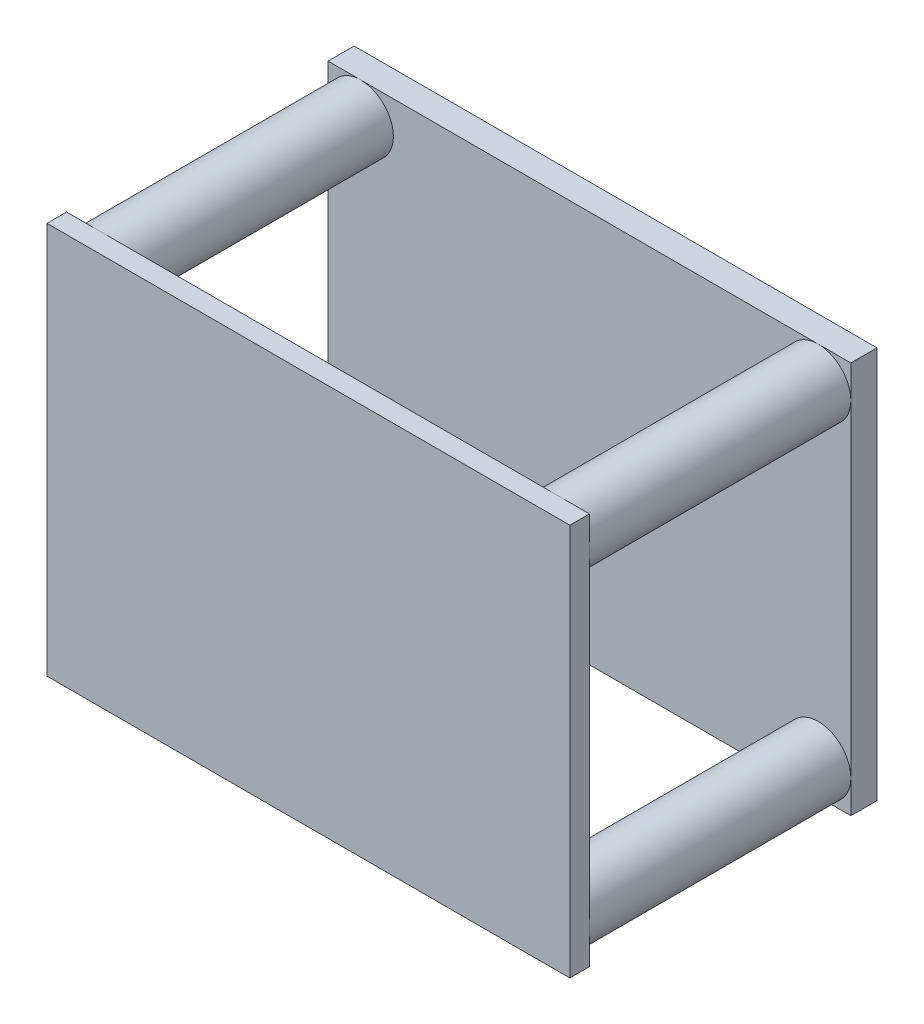
ISO-10303-21;
HEADER;
FILE_DESCRIPTION(('STEP AP214'),'2;1');
FILE_NAME('part.step','',(''),(''),'','','');
FILE_SCHEMA(('AUTOMOTIVE_DESIGN { 1 0 10303 214 1 1 1 1 }'));
ENDSEC;
DATA;
#1=APPLICATION_CONTEXT('core data for automotive mechanical design processes');
#2=APPLICATION_PROTOCOL_DEFINITION('international standard','automotive_design',2000,#1);
#3=PRODUCT_CONTEXT('',#1,'mechanical');
#4=PRODUCT('Part','Part','',(#3));
#5=PRODUCT_RELATED_PRODUCT_CATEGORY('part','',(#4));
#6=PRODUCT_DEFINITION_FORMATION('','',#4);
#7=PRODUCT_DEFINITION_CONTEXT('part definition',#1,'design');
#8=PRODUCT_DEFINITION('design','',#6,#7);
#9=PRODUCT_DEFINITION_SHAPE('','',#8);
#10=(LENGTH_UNIT() NAMED_UNIT(*) SI_UNIT(.MILLI.,.METRE.));
#11=(NAMED_UNIT(*) PLANE_ANGLE_UNIT() SI_UNIT($,.RADIAN.));
#12=(NAMED_UNIT(*) SI_UNIT($,.STERADIAN.) SOLID_ANGLE_UNIT());
#13=UNCERTAINTY_MEASURE_WITH_UNIT(LENGTH_MEASURE(1.E-05),#10,'distance_accuracy_value','');
#14=(GEOMETRIC_REPRESENTATION_CONTEXT(3) GLOBAL_UNCERTAINTY_ASSIGNED_CONTEXT((#13)) GLOBAL_UNIT_ASSIGNED_CONTEXT((#10,
#11,#12)) REPRESENTATION_CONTEXT('',''));
#15=CARTESIAN_POINT('',(0.,0.,0.));
#16=DIRECTION('',(0.,0.,1.));
#17=DIRECTION('',(1.,0.,0.));
#18=AXIS2_PLACEMENT_3D('',#15,#16,#17);
#19=CARTESIAN_POINT('',(0.,0.,235.));
#20=DIRECTION('',(0.,0.,1.));
#21=DIRECTION('',(1.,0.,0.));
#22=AXIS2_PLACEMENT_3D('',#19,#20,#21);
#23=PLANE('',#22);
#24=DIRECTION('',(1.,0.,0.));
#25=VECTOR('',#24,1.);
#26=CARTESIAN_POINT('',(-200.,-150.,235.));
#27=LINE('',#26,#25);
#28=CARTESIAN_POINT('',(-200.,-150.,235.));
#29=VERTEX_POINT('',#28);
#30=CARTESIAN_POINT('',(200.,-150.,235.));
#31=VERTEX_POINT('',#30);
#32=EDGE_CURVE('E11',#29,#31,#27,.T.);
#33=ORIENTED_EDGE('',*,*,#32,.T.);
#34=DIRECTION('',(0.,1.,0.));
#35=VECTOR('',#34,1.);
#36=CARTESIAN_POINT('',(200.,-150.,235.));
#37=LINE('',#36,#35);
#38=CARTESIAN_POINT('',(200.,150.,235.));
#39=VERTEX_POINT('',#38);
#40=EDGE_CURVE('E42',#31,#39,#37,.T.);
#41=ORIENTED_EDGE('',*,*,#40,.T.);
#42=DIRECTION('',(-1.,0.,0.));
#43=VECTOR('',#42,1.);
#44=CARTESIAN_POINT('',(200.,150.,235.));
#45=LINE('',#44,#43);
#46=CARTESIAN_POINT('',(-200.,150.,235.));
#47=VERTEX_POINT('',#46);
#48=EDGE_CURVE('E355',#39,#47,#45,.T.);
#49=ORIENTED_EDGE('',*,*,#48,.T.);
#50=DIRECTION('',(0.,-1.,0.));
#51=VECTOR('',#50,1.);
#52=CARTESIAN_POINT('',(-200.,150.,235.));
#53=LINE('',#52,#51);
#54=EDGE_CURVE('E410',#47,#29,#53,.T.);
#55=ORIENTED_EDGE('',*,*,#54,.T.);
#56=EDGE_LOOP('',(#33,#41,#49,#55));
#57=FACE_BOUND('',#56,.T.);
#58=ADVANCED_FACE('F17',(#57),#23,.T.);
#59=CARTESIAN_POINT('',(-200.,-150.,220.));
#60=DIRECTION('',(0.,1.,0.));
#61=DIRECTION('',(1.,0.,0.));
#62=AXIS2_PLACEMENT_3D('',#59,#60,#61);
#63=PLANE('',#62);
#64=DIRECTION('',(1.,0.,0.));
#65=VECTOR('',#64,1.);
#66=CARTESIAN_POINT('',(-200.,-150.,220.));
#67=LINE('',#66,#65);
#68=CARTESIAN_POINT('',(-200.,-150.,220.));
#69=VERTEX_POINT('',#68);
#70=CARTESIAN_POINT('',(-174.9999999999,-150.,220.));
#71=VERTEX_POINT('',#70);
#72=EDGE_CURVE('E304',#69,#71,#67,.T.);
#73=ORIENTED_EDGE('',*,*,#72,.T.);
#74=DIRECTION('',(1.,0.,0.));
#75=VECTOR('',#74,1.);
#76=CARTESIAN_POINT('',(-200.,-150.,220.));
#77=LINE('',#76,#75);
#78=CARTESIAN_POINT('',(175.,-150.,220.));
#79=VERTEX_POINT('',#78);
#80=EDGE_CURVE('E300',#71,#79,#77,.T.);
#81=ORIENTED_EDGE('',*,*,#80,.T.);
#82=DIRECTION('',(1.,0.,0.));
#83=VECTOR('',#82,1.);
#84=CARTESIAN_POINT('',(-200.,-150.,220.));
#85=LINE('',#84,#83);
#86=CARTESIAN_POINT('',(200.,-150.,220.));
#87=VERTEX_POINT('',#86);
#88=EDGE_CURVE('E251',#79,#87,#85,.T.);
#89=ORIENTED_EDGE('',*,*,#88,.T.);
#90=DIRECTION('',(0.,0.,1.));
#91=VECTOR('',#90,1.);
#92=CARTESIAN_POINT('',(200.,-150.,220.));
#93=LINE('',#92,#91);
#94=EDGE_CURVE('E25',#87,#31,#93,.T.);
#95=ORIENTED_EDGE('',*,*,#94,.T.);
#96=ORIENTED_EDGE('',*,*,#32,.F.);
#97=DIRECTION('',(0.,0.,1.));
#98=VECTOR('',#97,1.);
#99=CARTESIAN_POINT('',(-200.,-150.,220.));
#100=LINE('',#99,#98);
#101=EDGE_CURVE('E406',#69,#29,#100,.T.);
#102=ORIENTED_EDGE('',*,*,#101,.F.);
#103=EDGE_LOOP('',(#73,#81,#89,#95,#96,#102));
#104=FACE_BOUND('',#103,.T.);
#105=ADVANCED_FACE('F640',(#104),#63,.F.);
#106=CARTESIAN_POINT('',(200.,-150.,220.));
#107=DIRECTION('',(-1.,0.,0.));
#108=DIRECTION('',(0.,0.,1.));
#109=AXIS2_PLACEMENT_3D('',#106,#107,#108);
#110=PLANE('',#109);
#111=DIRECTION('',(0.,1.,0.));
#112=VECTOR('',#111,1.);
#113=CARTESIAN_POINT('',(200.,-150.,220.));
#114=LINE('',#113,#112);
#115=CARTESIAN_POINT('',(200.,-125.,220.));
#116=VERTEX_POINT('',#115);
#117=EDGE_CURVE('E248',#87,#116,#114,.T.);
#118=ORIENTED_EDGE('',*,*,#117,.T.);
#119=DIRECTION('',(0.,1.,0.));
#120=VECTOR('',#119,1.);
#121=CARTESIAN_POINT('',(200.,-150.,220.));
#122=LINE('',#121,#120);
#123=CARTESIAN_POINT('',(200.,125.,220.));
#124=VERTEX_POINT('',#123);
#125=EDGE_CURVE('E305',#116,#124,#122,.T.);
#126=ORIENTED_EDGE('',*,*,#125,.T.);
#127=DIRECTION('',(0.,1.,0.));
#128=VECTOR('',#127,1.);
#129=CARTESIAN_POINT('',(200.,-150.,220.));
#130=LINE('',#129,#128);
#131=CARTESIAN_POINT('',(200.,150.,220.));
#132=VERTEX_POINT('',#131);
#133=EDGE_CURVE('E252',#124,#132,#130,.T.);
#134=ORIENTED_EDGE('',*,*,#133,.T.);
#135=DIRECTION('',(0.,0.,1.));
#136=VECTOR('',#135,1.);
#137=CARTESIAN_POINT('',(200.,150.,220.));
#138=LINE('',#137,#136);
#139=EDGE_CURVE('E352',#132,#39,#138,.T.);
#140=ORIENTED_EDGE('',*,*,#139,.T.);
#141=ORIENTED_EDGE('',*,*,#40,.F.);
#142=ORIENTED_EDGE('',*,*,#94,.F.);
#143=EDGE_LOOP('',(#118,#126,#134,#140,#141,#142));
#144=FACE_BOUND('',#143,.T.);
#145=ADVANCED_FACE('F634',(#144),#110,.F.);
#146=CARTESIAN_POINT('',(200.,150.,220.));
#147=DIRECTION('',(0.,-1.,0.));
#148=DIRECTION('',(0.,0.,-1.));
#149=AXIS2_PLACEMENT_3D('',#146,#147,#148);
#150=PLANE('',#149);
#151=DIRECTION('',(-1.,0.,0.));
#152=VECTOR('',#151,1.);
#153=CARTESIAN_POINT('',(200.,150.,220.));
#154=LINE('',#153,#152);
#155=CARTESIAN_POINT('',(175.,150.,220.));
#156=VERTEX_POINT('',#155);
#157=EDGE_CURVE('E381',#132,#156,#154,.T.);
#158=ORIENTED_EDGE('',*,*,#157,.T.);
#159=DIRECTION('',(-1.,0.,0.));
#160=VECTOR('',#159,1.);
#161=CARTESIAN_POINT('',(200.,150.,220.));
#162=LINE('',#161,#160);
#163=CARTESIAN_POINT('',(-174.9999999999,150.,220.));
#164=VERTEX_POINT('',#163);
#165=EDGE_CURVE('E380',#156,#164,#162,.T.);
#166=ORIENTED_EDGE('',*,*,#165,.T.);
#167=DIRECTION('',(-1.,0.,0.));
#168=VECTOR('',#167,1.);
#169=CARTESIAN_POINT('',(200.,150.,220.));
#170=LINE('',#169,#168);
#171=CARTESIAN_POINT('',(-200.,150.,220.));
#172=VERTEX_POINT('',#171);
#173=EDGE_CURVE('E394',#164,#172,#170,.T.);
#174=ORIENTED_EDGE('',*,*,#173,.T.);
#175=DIRECTION('',(0.,0.,1.));
#176=VECTOR('',#175,1.);
#177=CARTESIAN_POINT('',(-200.,150.,220.));
#178=LINE('',#177,#176);
#179=EDGE_CURVE('E413',#172,#47,#178,.T.);
#180=ORIENTED_EDGE('',*,*,#179,.T.);
#181=ORIENTED_EDGE('',*,*,#48,.F.);
#182=ORIENTED_EDGE('',*,*,#139,.F.);
#183=EDGE_LOOP('',(#158,#166,#174,#180,#181,#182));
#184=FACE_BOUND('',#183,.T.);
#185=ADVANCED_FACE('F639',(#184),#150,.F.);
#186=CARTESIAN_POINT('',(-200.,150.,220.));
#187=DIRECTION('',(1.,0.,0.));
#188=DIRECTION('',(0.,1.,0.));
#189=AXIS2_PLACEMENT_3D('',#186,#187,#188);
#190=PLANE('',#189);
#191=DIRECTION('',(0.,-1.,0.));
#192=VECTOR('',#191,1.);
#193=CARTESIAN_POINT('',(-200.,150.,220.));
#194=LINE('',#193,#192);
#195=CARTESIAN_POINT('',(-200.,125.,220.));
#196=VERTEX_POINT('',#195);
#197=EDGE_CURVE('E384',#172,#196,#194,.T.);
#198=ORIENTED_EDGE('',*,*,#197,.T.);
#199=DIRECTION('',(0.,-1.,0.));
#200=VECTOR('',#199,1.);
#201=CARTESIAN_POINT('',(-200.,150.,220.));
#202=LINE('',#201,#200);
#203=CARTESIAN_POINT('',(-200.,-124.999999783,220.));
#204=VERTEX_POINT('',#203);
#205=EDGE_CURVE('E376',#196,#204,#202,.T.);
#206=ORIENTED_EDGE('',*,*,#205,.T.);
#207=DIRECTION('',(0.,-1.,0.));
#208=VECTOR('',#207,1.);
#209=CARTESIAN_POINT('',(-200.,150.,220.));
#210=LINE('',#209,#208);
#211=EDGE_CURVE('E393',#204,#69,#210,.T.);
#212=ORIENTED_EDGE('',*,*,#211,.T.);
#213=ORIENTED_EDGE('',*,*,#101,.T.);
#214=ORIENTED_EDGE('',*,*,#54,.F.);
#215=ORIENTED_EDGE('',*,*,#179,.F.);
#216=EDGE_LOOP('',(#198,#206,#212,#213,#214,#215));
#217=FACE_BOUND('',#216,.T.);
#218=ADVANCED_FACE('F677',(#217),#190,.F.);
#219=CARTESIAN_POINT('',(0.,0.,220.));
#220=DIRECTION('',(0.,0.,1.));
#221=DIRECTION('',(1.,0.,0.));
#222=AXIS2_PLACEMENT_3D('',#219,#220,#221);
#223=PLANE('',#222);
#224=ORIENTED_EDGE('',*,*,#117,.F.);
#225=ORIENTED_EDGE('',*,*,#88,.F.);
#226=CARTESIAN_POINT('',(175.,-125.,220.));
#227=DIRECTION('',(0.,0.,1.));
#228=DIRECTION('',(1.,0.,0.));
#229=AXIS2_PLACEMENT_3D('',#226,#227,#228);
#230=CIRCLE('',#229,25.);
#231=EDGE_CURVE('E371',#79,#116,#230,.T.);
#232=ORIENTED_EDGE('',*,*,#231,.T.);
#233=EDGE_LOOP('',(#224,#225,#232));
#234=FACE_BOUND('',#233,.T.);
#235=ADVANCED_FACE('F668',(#234),#223,.F.);
#236=CARTESIAN_POINT('',(0.,0.,220.));
#237=DIRECTION('',(0.,0.,1.));
#238=DIRECTION('',(1.,0.,0.));
#239=AXIS2_PLACEMENT_3D('',#236,#237,#238);
#240=PLANE('',#239);
#241=ORIENTED_EDGE('',*,*,#157,.F.);
#242=ORIENTED_EDGE('',*,*,#133,.F.);
#243=CARTESIAN_POINT('',(175.,125.,220.));
#244=DIRECTION('',(0.,0.,1.));
#245=DIRECTION('',(1.,0.,0.));
#246=AXIS2_PLACEMENT_3D('',#243,#244,#245);
#247=CIRCLE('',#246,25.);
#248=EDGE_CURVE('E363',#124,#156,#247,.T.);
#249=ORIENTED_EDGE('',*,*,#248,.T.);
#250=EDGE_LOOP('',(#241,#242,#249));
#251=FACE_BOUND('',#250,.T.);
#252=ADVANCED_FACE('F659',(#251),#240,.F.);
#253=CARTESIAN_POINT('',(0.,0.,220.));
#254=DIRECTION('',(0.,0.,1.));
#255=DIRECTION('',(1.,0.,0.));
#256=AXIS2_PLACEMENT_3D('',#253,#254,#255);
#257=PLANE('',#256);
#258=ORIENTED_EDGE('',*,*,#173,.F.);
#259=CARTESIAN_POINT('',(-175.,125.,220.));
#260=DIRECTION('',(0.,0.,1.));
#261=DIRECTION('',(1.,0.,0.));
#262=AXIS2_PLACEMENT_3D('',#259,#260,#261);
#263=CIRCLE('',#262,25.);
#264=EDGE_CURVE('E332',#164,#196,#263,.T.);
#265=ORIENTED_EDGE('',*,*,#264,.T.);
#266=ORIENTED_EDGE('',*,*,#197,.F.);
#267=EDGE_LOOP('',(#258,#265,#266));
#268=FACE_BOUND('',#267,.T.);
#269=ADVANCED_FACE('F650',(#268),#257,.F.);
#270=CARTESIAN_POINT('',(0.,0.,220.));
#271=DIRECTION('',(0.,0.,1.));
#272=DIRECTION('',(1.,0.,0.));
#273=AXIS2_PLACEMENT_3D('',#270,#271,#272);
#274=PLANE('',#273);
#275=CARTESIAN_POINT('',(-175.,-125.,220.));
#276=DIRECTION('',(0.,0.,1.));
#277=DIRECTION('',(1.,0.,0.));
#278=AXIS2_PLACEMENT_3D('',#275,#276,#277);
#279=CIRCLE('',#278,25.);
#280=EDGE_CURVE('E327',#204,#71,#279,.T.);
#281=ORIENTED_EDGE('',*,*,#280,.T.);
#282=ORIENTED_EDGE('',*,*,#72,.F.);
#283=ORIENTED_EDGE('',*,*,#211,.F.);
#284=EDGE_LOOP('',(#281,#282,#283));
#285=FACE_BOUND('',#284,.T.);
#286=ADVANCED_FACE('F628',(#285),#274,.F.);
#287=CARTESIAN_POINT('',(0.,0.,220.));
#288=DIRECTION('',(0.,0.,1.));
#289=DIRECTION('',(1.,0.,0.));
#290=AXIS2_PLACEMENT_3D('',#287,#288,#289);
#291=PLANE('',#290);
#292=CARTESIAN_POINT('',(-175.,-125.,220.));
#293=DIRECTION('',(0.,0.,1.));
#294=DIRECTION('',(1.,0.,0.));
#295=AXIS2_PLACEMENT_3D('',#292,#293,#294);
#296=CIRCLE('',#295,25.);
#297=CARTESIAN_POINT('',(-150.,-125.,220.));
#298=VERTEX_POINT('',#297);
#299=EDGE_CURVE('E331',#298,#204,#296,.T.);
#300=ORIENTED_EDGE('',*,*,#299,.T.);
#301=ORIENTED_EDGE('',*,*,#205,.F.);
#302=CARTESIAN_POINT('',(-175.,125.,220.));
#303=DIRECTION('',(0.,0.,1.));
#304=DIRECTION('',(1.,0.,0.));
#305=AXIS2_PLACEMENT_3D('',#302,#303,#304);
#306=CIRCLE('',#305,25.);
#307=CARTESIAN_POINT('',(-150.,125.,220.));
#308=VERTEX_POINT('',#307);
#309=EDGE_CURVE('E337',#196,#308,#306,.T.);
#310=ORIENTED_EDGE('',*,*,#309,.T.);
#311=CARTESIAN_POINT('',(-175.,125.,220.));
#312=DIRECTION('',(0.,0.,1.));
#313=DIRECTION('',(1.,0.,0.));
#314=AXIS2_PLACEMENT_3D('',#311,#312,#313);
#315=CIRCLE('',#314,25.);
#316=EDGE_CURVE('E336',#308,#164,#315,.T.);
#317=ORIENTED_EDGE('',*,*,#316,.T.);
#318=ORIENTED_EDGE('',*,*,#165,.F.);
#319=CARTESIAN_POINT('',(175.,125.,220.));
#320=DIRECTION('',(0.,0.,1.));
#321=DIRECTION('',(1.,0.,0.));
#322=AXIS2_PLACEMENT_3D('',#319,#320,#321);
#323=CIRCLE('',#322,25.);
#324=EDGE_CURVE('E359',#156,#124,#323,.T.);
#325=ORIENTED_EDGE('',*,*,#324,.T.);
#326=ORIENTED_EDGE('',*,*,#125,.F.);
#327=CARTESIAN_POINT('',(175.,-125.,220.));
#328=DIRECTION('',(0.,0.,1.));
#329=DIRECTION('',(1.,0.,0.));
#330=AXIS2_PLACEMENT_3D('',#327,#328,#329);
#331=CIRCLE('',#330,25.);
#332=EDGE_CURVE('E375',#116,#79,#331,.T.);
#333=ORIENTED_EDGE('',*,*,#332,.T.);
#334=ORIENTED_EDGE('',*,*,#80,.F.);
#335=CARTESIAN_POINT('',(-175.,-125.,220.));
#336=DIRECTION('',(0.,0.,1.));
#337=DIRECTION('',(1.,0.,0.));
#338=AXIS2_PLACEMENT_3D('',#335,#336,#337);
#339=CIRCLE('',#338,25.);
#340=EDGE_CURVE('E291',#71,#298,#339,.T.);
#341=ORIENTED_EDGE('',*,*,#340,.T.);
#342=EDGE_LOOP('',(#300,#301,#310,#317,#318,#325,#326,#333,#334,#341));
#343=FACE_BOUND('',#342,.T.);
#344=ADVANCED_FACE('F619',(#343),#291,.F.);
#345=CARTESIAN_POINT('',(175.,125.,20.));
#346=DIRECTION('',(0.,0.,1.));
#347=DIRECTION('',(1.,0.,0.));
#348=AXIS2_PLACEMENT_3D('',#345,#346,#347);
#349=PLANE('',#348);
#350=CARTESIAN_POINT('',(175.,125.,20.));
#351=DIRECTION('',(0.,0.,-1.));
#352=DIRECTION('',(1.,0.,0.));
#353=AXIS2_PLACEMENT_3D('',#350,#351,#352);
#354=CIRCLE('',#353,8.);
#355=CARTESIAN_POINT('',(183.,125.,20.));
#356=VERTEX_POINT('',#355);
#357=EDGE_CURVE('E292',#356,#356,#354,.T.);
#358=ORIENTED_EDGE('',*,*,#357,.T.);
#359=EDGE_LOOP('',(#358));
#360=FACE_BOUND('',#359,.T.);
#361=ADVANCED_FACE('F610',(#360),#349,.F.);
#362=CARTESIAN_POINT('',(-175.,125.,20.));
#363=DIRECTION('',(0.,0.,1.));
#364=DIRECTION('',(1.,0.,0.));
#365=AXIS2_PLACEMENT_3D('',#362,#363,#364);
#366=PLANE('',#365);
#367=CARTESIAN_POINT('',(-175.,125.,20.));
#368=DIRECTION('',(0.,0.,-1.));
#369=DIRECTION('',(1.,0.,0.));
#370=AXIS2_PLACEMENT_3D('',#367,#368,#369);
#371=CIRCLE('',#370,8.);
#372=CARTESIAN_POINT('',(-167.,125.,20.));
#373=VERTEX_POINT('',#372);
#374=EDGE_CURVE('E317',#373,#373,#371,.T.);
#375=ORIENTED_EDGE('',*,*,#374,.T.);
#376=EDGE_LOOP('',(#375));
#377=FACE_BOUND('',#376,.T.);
#378=ADVANCED_FACE('F601',(#377),#366,.F.);
#379=CARTESIAN_POINT('',(175.,-125.,20.));
#380=DIRECTION('',(0.,0.,1.));
#381=DIRECTION('',(1.,0.,0.));
#382=AXIS2_PLACEMENT_3D('',#379,#380,#381);
#383=PLANE('',#382);
#384=CARTESIAN_POINT('',(175.,-125.,20.));
#385=DIRECTION('',(0.,0.,-1.));
#386=DIRECTION('',(1.,0.,0.));
#387=AXIS2_PLACEMENT_3D('',#384,#385,#386);
#388=CIRCLE('',#387,8.);
#389=CARTESIAN_POINT('',(183.,-125.,20.));
#390=VERTEX_POINT('',#389);
#391=EDGE_CURVE('E218',#390,#390,#388,.T.);
#392=ORIENTED_EDGE('',*,*,#391,.T.);
#393=EDGE_LOOP('',(#392));
#394=FACE_BOUND('',#393,.T.);
#395=ADVANCED_FACE('F592',(#394),#383,.F.);
#396=CARTESIAN_POINT('',(-175.,-125.,20.));
#397=DIRECTION('',(0.,0.,1.));
#398=DIRECTION('',(1.,0.,0.));
#399=AXIS2_PLACEMENT_3D('',#396,#397,#398);
#400=PLANE('',#399);
#401=CARTESIAN_POINT('',(-175.,-125.,20.));
#402=DIRECTION('',(0.,0.,-1.));
#403=DIRECTION('',(1.,0.,0.));
#404=AXIS2_PLACEMENT_3D('',#401,#402,#403);
#405=CIRCLE('',#404,8.);
#406=CARTESIAN_POINT('',(-167.,-125.,20.));
#407=VERTEX_POINT('',#406);
#408=EDGE_CURVE('E220',#407,#407,#405,.T.);
#409=ORIENTED_EDGE('',*,*,#408,.T.);
#410=EDGE_LOOP('',(#409));
#411=FACE_BOUND('',#410,.T.);
#412=ADVANCED_FACE('F583',(#411),#400,.F.);
#413=CARTESIAN_POINT('',(175.,-125.,20.));
#414=DIRECTION('',(0.,0.,1.));
#415=DIRECTION('',(1.,0.,0.));
#416=AXIS2_PLACEMENT_3D('',#413,#414,#415);
#417=CYLINDRICAL_SURFACE('',#416,25.);
#418=CARTESIAN_POINT('',(175.,-125.,20.));
#419=DIRECTION('',(0.,0.,1.));
#420=DIRECTION('',(1.,0.,0.));
#421=AXIS2_PLACEMENT_3D('',#418,#419,#420);
#422=CIRCLE('',#421,25.);
#423=CARTESIAN_POINT('',(175.,-150.,20.));
#424=VERTEX_POINT('',#423);
#425=CARTESIAN_POINT('',(200.,-125.,20.));
#426=VERTEX_POINT('',#425);
#427=EDGE_CURVE('E279',#424,#426,#422,.T.);
#428=ORIENTED_EDGE('',*,*,#427,.T.);
#429=DIRECTION('',(0.,0.,1.));
#430=VECTOR('',#429,1.);
#431=CARTESIAN_POINT('',(200.,-125.,20.));
#432=LINE('',#431,#430);
#433=EDGE_CURVE('E367',#426,#116,#432,.T.);
#434=ORIENTED_EDGE('',*,*,#433,.T.);
#435=ORIENTED_EDGE('',*,*,#231,.F.);
#436=ORIENTED_EDGE('',*,*,#332,.F.);
#437=ORIENTED_EDGE('',*,*,#433,.F.);
#438=CARTESIAN_POINT('',(175.,-125.,20.));
#439=DIRECTION('',(0.,0.,1.));
#440=DIRECTION('',(1.,0.,0.));
#441=AXIS2_PLACEMENT_3D('',#438,#439,#440);
#442=CIRCLE('',#441,25.);
#443=EDGE_CURVE('E259',#426,#424,#442,.T.);
#444=ORIENTED_EDGE('',*,*,#443,.T.);
#445=EDGE_LOOP('',(#428,#434,#435,#436,#437,#444));
#446=FACE_BOUND('',#445,.T.);
#447=ADVANCED_FACE('F574',(#446),#417,.T.);
#448=CARTESIAN_POINT('',(175.,125.,20.));
#449=DIRECTION('',(0.,0.,1.));
#450=DIRECTION('',(1.,0.,0.));
#451=AXIS2_PLACEMENT_3D('',#448,#449,#450);
#452=CYLINDRICAL_SURFACE('',#451,25.);
#453=CARTESIAN_POINT('',(175.,125.,20.));
#454=DIRECTION('',(0.,0.,1.));
#455=DIRECTION('',(1.,0.,0.));
#456=AXIS2_PLACEMENT_3D('',#453,#454,#455);
#457=CIRCLE('',#456,25.);
#458=CARTESIAN_POINT('',(175.,150.,20.));
#459=VERTEX_POINT('',#458);
#460=CARTESIAN_POINT('',(200.,125.,20.));
#461=VERTEX_POINT('',#460);
#462=EDGE_CURVE('E263',#459,#461,#457,.T.);
#463=ORIENTED_EDGE('',*,*,#462,.T.);
#464=DIRECTION('',(0.,0.,1.));
#465=VECTOR('',#464,1.);
#466=CARTESIAN_POINT('',(200.,125.,20.));
#467=LINE('',#466,#465);
#468=EDGE_CURVE('E351',#461,#124,#467,.T.);
#469=ORIENTED_EDGE('',*,*,#468,.T.);
#470=ORIENTED_EDGE('',*,*,#324,.F.);
#471=ORIENTED_EDGE('',*,*,#248,.F.);
#472=ORIENTED_EDGE('',*,*,#468,.F.);
#473=CARTESIAN_POINT('',(175.,125.,20.));
#474=DIRECTION('',(0.,0.,1.));
#475=DIRECTION('',(1.,0.,0.));
#476=AXIS2_PLACEMENT_3D('',#473,#474,#475);
#477=CIRCLE('',#476,25.);
#478=EDGE_CURVE('E299',#461,#459,#477,.T.);
#479=ORIENTED_EDGE('',*,*,#478,.T.);
#480=EDGE_LOOP('',(#463,#469,#470,#471,#472,#479));
#481=FACE_BOUND('',#480,.T.);
#482=ADVANCED_FACE('F565',(#481),#452,.T.);
#483=CARTESIAN_POINT('',(-175.,125.,20.));
#484=DIRECTION('',(0.,0.,1.));
#485=DIRECTION('',(1.,0.,0.));
#486=AXIS2_PLACEMENT_3D('',#483,#484,#485);
#487=CYLINDRICAL_SURFACE('',#486,25.);
#488=CARTESIAN_POINT('',(-175.,125.,20.));
#489=DIRECTION('',(0.,0.,1.));
#490=DIRECTION('',(1.,0.,0.));
#491=AXIS2_PLACEMENT_3D('',#488,#489,#490);
#492=CIRCLE('',#491,25.);
#493=CARTESIAN_POINT('',(-200.,125.,20.));
#494=VERTEX_POINT('',#493);
#495=CARTESIAN_POINT('',(-150.,125.,20.));
#496=VERTEX_POINT('',#495);
#497=EDGE_CURVE('E275',#494,#496,#492,.T.);
#498=ORIENTED_EDGE('',*,*,#497,.T.);
#499=DIRECTION('',(0.,0.,1.));
#500=VECTOR('',#499,1.);
#501=CARTESIAN_POINT('',(-150.,125.,20.));
#502=LINE('',#501,#500);
#503=EDGE_CURVE('E341',#496,#308,#502,.T.);
#504=ORIENTED_EDGE('',*,*,#503,.T.);
#505=ORIENTED_EDGE('',*,*,#309,.F.);
#506=ORIENTED_EDGE('',*,*,#264,.F.);
#507=ORIENTED_EDGE('',*,*,#316,.F.);
#508=ORIENTED_EDGE('',*,*,#503,.F.);
#509=CARTESIAN_POINT('',(-175.,125.,20.));
#510=DIRECTION('',(0.,0.,1.));
#511=DIRECTION('',(1.,0.,0.));
#512=AXIS2_PLACEMENT_3D('',#509,#510,#511);
#513=CIRCLE('',#512,25.);
#514=CARTESIAN_POINT('',(-174.9999999999,150.,20.));
#515=VERTEX_POINT('',#514);
#516=EDGE_CURVE('E271',#496,#515,#513,.T.);
#517=ORIENTED_EDGE('',*,*,#516,.T.);
#518=CARTESIAN_POINT('',(-175.,125.,20.));
#519=DIRECTION('',(0.,0.,1.));
#520=DIRECTION('',(1.,0.,0.));
#521=AXIS2_PLACEMENT_3D('',#518,#519,#520);
#522=CIRCLE('',#521,25.);
#523=EDGE_CURVE('E296',#515,#494,#522,.T.);
#524=ORIENTED_EDGE('',*,*,#523,.T.);
#525=EDGE_LOOP('',(#498,#504,#505,#506,#507,#508,#517,#524));
#526=FACE_BOUND('',#525,.T.);
#527=ADVANCED_FACE('F483',(#526),#487,.T.);
#528=CARTESIAN_POINT('',(-175.,-125.,20.));
#529=DIRECTION('',(0.,0.,1.));
#530=DIRECTION('',(1.,0.,0.));
#531=AXIS2_PLACEMENT_3D('',#528,#529,#530);
#532=CYLINDRICAL_SURFACE('',#531,25.);
#533=CARTESIAN_POINT('',(-175.,-125.,20.));
#534=DIRECTION('',(0.,0.,1.));
#535=DIRECTION('',(1.,0.,0.));
#536=AXIS2_PLACEMENT_3D('',#533,#534,#535);
#537=CIRCLE('',#536,25.);
#538=CARTESIAN_POINT('',(-174.9999999999,-150.,20.));
#539=VERTEX_POINT('',#538);
#540=CARTESIAN_POINT('',(-150.,-125.,20.));
#541=VERTEX_POINT('',#540);
#542=EDGE_CURVE('E247',#539,#541,#537,.T.);
#543=ORIENTED_EDGE('',*,*,#542,.T.);
#544=DIRECTION('',(0.,0.,1.));
#545=VECTOR('',#544,1.);
#546=CARTESIAN_POINT('',(-150.,-125.,20.));
#547=LINE('',#546,#545);
#548=EDGE_CURVE('E287',#541,#298,#547,.T.);
#549=ORIENTED_EDGE('',*,*,#548,.T.);
#550=ORIENTED_EDGE('',*,*,#340,.F.);
#551=ORIENTED_EDGE('',*,*,#280,.F.);
#552=ORIENTED_EDGE('',*,*,#299,.F.);
#553=ORIENTED_EDGE('',*,*,#548,.F.);
#554=CARTESIAN_POINT('',(-175.,-125.,20.));
#555=DIRECTION('',(0.,0.,1.));
#556=DIRECTION('',(1.,0.,0.));
#557=AXIS2_PLACEMENT_3D('',#554,#555,#556);
#558=CIRCLE('',#557,25.);
#559=CARTESIAN_POINT('',(-200.,-124.999999783,20.));
#560=VERTEX_POINT('',#559);
#561=EDGE_CURVE('E276',#541,#560,#558,.T.);
#562=ORIENTED_EDGE('',*,*,#561,.T.);
#563=CARTESIAN_POINT('',(-175.,-125.,20.));
#564=DIRECTION('',(0.,0.,1.));
#565=DIRECTION('',(1.,0.,0.));
#566=AXIS2_PLACEMENT_3D('',#563,#564,#565);
#567=CIRCLE('',#566,25.);
#568=EDGE_CURVE('E243',#560,#539,#567,.T.);
#569=ORIENTED_EDGE('',*,*,#568,.T.);
#570=EDGE_LOOP('',(#543,#549,#550,#551,#552,#553,#562,#569));
#571=FACE_BOUND('',#570,.T.);
#572=ADVANCED_FACE('F477',(#571),#532,.T.);
#573=CARTESIAN_POINT('',(175.,125.,0.));
#574=DIRECTION('',(0.,0.,-1.));
#575=DIRECTION('',(1.,0.,0.));
#576=AXIS2_PLACEMENT_3D('',#573,#574,#575);
#577=CYLINDRICAL_SURFACE('',#576,8.);
#578=CARTESIAN_POINT('',(175.,125.,0.));
#579=DIRECTION('',(0.,0.,1.));
#580=DIRECTION('',(1.,0.,0.));
#581=AXIS2_PLACEMENT_3D('',#578,#579,#580);
#582=CIRCLE('',#581,8.);
#583=CARTESIAN_POINT('',(183.,125.,0.));
#584=VERTEX_POINT('',#583);
#585=EDGE_CURVE('E233',#584,#584,#582,.T.);
#586=ORIENTED_EDGE('',*,*,#585,.F.);
#587=DIRECTION('',(0.,0.,1.));
#588=VECTOR('',#587,1.);
#589=CARTESIAN_POINT('',(183.,125.,0.));
#590=LINE('',#589,#588);
#591=EDGE_CURVE('E318',#584,#356,#590,.T.);
#592=ORIENTED_EDGE('',*,*,#591,.T.);
#593=ORIENTED_EDGE('',*,*,#357,.F.);
#594=ORIENTED_EDGE('',*,*,#591,.F.);
#595=EDGE_LOOP('',(#586,#592,#593,#594));
#596=FACE_BOUND('',#595,.T.);
#597=ADVANCED_FACE('F482',(#596),#577,.F.);
#598=CARTESIAN_POINT('',(-175.,125.,0.));
#599=DIRECTION('',(0.,0.,-1.));
#600=DIRECTION('',(1.,0.,0.));
#601=AXIS2_PLACEMENT_3D('',#598,#599,#600);
#602=CYLINDRICAL_SURFACE('',#601,8.);
#603=CARTESIAN_POINT('',(-175.,125.,0.));
#604=DIRECTION('',(0.,0.,1.));
#605=DIRECTION('',(1.,0.,0.));
#606=AXIS2_PLACEMENT_3D('',#603,#604,#605);
#607=CIRCLE('',#606,8.);
#608=CARTESIAN_POINT('',(-167.,125.,0.));
#609=VERTEX_POINT('',#608);
#610=EDGE_CURVE('E226',#609,#609,#607,.T.);
#611=ORIENTED_EDGE('',*,*,#610,.F.);
#612=DIRECTION('',(0.,0.,1.));
#613=VECTOR('',#612,1.);
#614=CARTESIAN_POINT('',(-167.,125.,0.));
#615=LINE('',#614,#613);
#616=EDGE_CURVE('E255',#609,#373,#615,.T.);
#617=ORIENTED_EDGE('',*,*,#616,.T.);
#618=ORIENTED_EDGE('',*,*,#374,.F.);
#619=ORIENTED_EDGE('',*,*,#616,.F.);
#620=EDGE_LOOP('',(#611,#617,#618,#619));
#621=FACE_BOUND('',#620,.T.);
#622=ADVANCED_FACE('F520',(#621),#602,.F.);
#623=CARTESIAN_POINT('',(175.,-125.,0.));
#624=DIRECTION('',(0.,0.,-1.));
#625=DIRECTION('',(1.,0.,0.));
#626=AXIS2_PLACEMENT_3D('',#623,#624,#625);
#627=CYLINDRICAL_SURFACE('',#626,8.);
#628=CARTESIAN_POINT('',(175.,-125.,0.));
#629=DIRECTION('',(0.,0.,1.));
#630=DIRECTION('',(1.,0.,0.));
#631=AXIS2_PLACEMENT_3D('',#628,#629,#630);
#632=CIRCLE('',#631,8.);
#633=CARTESIAN_POINT('',(183.,-125.,0.));
#634=VERTEX_POINT('',#633);
#635=EDGE_CURVE('E217',#634,#634,#632,.T.);
#636=ORIENTED_EDGE('',*,*,#635,.F.);
#637=DIRECTION('',(0.,0.,1.));
#638=VECTOR('',#637,1.);
#639=CARTESIAN_POINT('',(183.,-125.,0.));
#640=LINE('',#639,#638);
#641=EDGE_CURVE('E214',#634,#390,#640,.T.);
#642=ORIENTED_EDGE('',*,*,#641,.T.);
#643=ORIENTED_EDGE('',*,*,#391,.F.);
#644=ORIENTED_EDGE('',*,*,#641,.F.);
#645=EDGE_LOOP('',(#636,#642,#643,#644));
#646=FACE_BOUND('',#645,.T.);
#647=ADVANCED_FACE('F216',(#646),#627,.F.);
#648=CARTESIAN_POINT('',(-175.,-125.,0.));
#649=DIRECTION('',(0.,0.,-1.));
#650=DIRECTION('',(1.,0.,0.));
#651=AXIS2_PLACEMENT_3D('',#648,#649,#650);
#652=CYLINDRICAL_SURFACE('',#651,8.);
#653=CARTESIAN_POINT('',(-175.,-125.,0.));
#654=DIRECTION('',(0.,0.,1.));
#655=DIRECTION('',(1.,0.,0.));
#656=AXIS2_PLACEMENT_3D('',#653,#654,#655);
#657=CIRCLE('',#656,8.);
#658=CARTESIAN_POINT('',(-167.,-125.,0.));
#659=VERTEX_POINT('',#658);
#660=EDGE_CURVE('E227',#659,#659,#657,.T.);
#661=ORIENTED_EDGE('',*,*,#660,.F.);
#662=DIRECTION('',(0.,0.,1.));
#663=VECTOR('',#662,1.);
#664=CARTESIAN_POINT('',(-167.,-125.,0.));
#665=LINE('',#664,#663);
#666=EDGE_CURVE('E308',#659,#407,#665,.T.);
#667=ORIENTED_EDGE('',*,*,#666,.T.);
#668=ORIENTED_EDGE('',*,*,#408,.F.);
#669=ORIENTED_EDGE('',*,*,#666,.F.);
#670=EDGE_LOOP('',(#661,#667,#668,#669));
#671=FACE_BOUND('',#670,.T.);
#672=ADVANCED_FACE('F456',(#671),#652,.F.);
#673=CARTESIAN_POINT('',(0.,0.,20.));
#674=DIRECTION('',(0.,0.,1.));
#675=DIRECTION('',(1.,0.,0.));
#676=AXIS2_PLACEMENT_3D('',#673,#674,#675);
#677=PLANE('',#676);
#678=ORIENTED_EDGE('',*,*,#478,.F.);
#679=DIRECTION('',(0.,1.,0.));
#680=VECTOR('',#679,1.);
#681=CARTESIAN_POINT('',(200.,-150.,20.));
#682=LINE('',#681,#680);
#683=CARTESIAN_POINT('',(200.,150.,20.));
#684=VERTEX_POINT('',#683);
#685=EDGE_CURVE('E791',#461,#684,#682,.T.);
#686=ORIENTED_EDGE('',*,*,#685,.T.);
#687=DIRECTION('',(-1.,0.,0.));
#688=VECTOR('',#687,1.);
#689=CARTESIAN_POINT('',(200.,150.,20.));
#690=LINE('',#689,#688);
#691=EDGE_CURVE('E286',#684,#459,#690,.T.);
#692=ORIENTED_EDGE('',*,*,#691,.T.);
#693=EDGE_LOOP('',(#678,#686,#692));
#694=FACE_BOUND('',#693,.T.);
#695=ADVANCED_FACE('F461',(#694),#677,.T.);
#696=CARTESIAN_POINT('',(0.,0.,20.));
#697=DIRECTION('',(0.,0.,1.));
#698=DIRECTION('',(1.,0.,0.));
#699=AXIS2_PLACEMENT_3D('',#696,#697,#698);
#700=PLANE('',#699);
#701=DIRECTION('',(0.,-1.,0.));
#702=VECTOR('',#701,1.);
#703=CARTESIAN_POINT('',(-200.,150.,20.));
#704=LINE('',#703,#702);
#705=CARTESIAN_POINT('',(-200.,150.,20.));
#706=VERTEX_POINT('',#705);
#707=EDGE_CURVE('E766',#706,#494,#704,.T.);
#708=ORIENTED_EDGE('',*,*,#707,.T.);
#709=ORIENTED_EDGE('',*,*,#523,.F.);
#710=DIRECTION('',(-1.,0.,0.));
#711=VECTOR('',#710,1.);
#712=CARTESIAN_POINT('',(200.,150.,20.));
#713=LINE('',#712,#711);
#714=EDGE_CURVE('E283',#515,#706,#713,.T.);
#715=ORIENTED_EDGE('',*,*,#714,.T.);
#716=EDGE_LOOP('',(#708,#709,#715));
#717=FACE_BOUND('',#716,.T.);
#718=ADVANCED_FACE('F528',(#717),#700,.T.);
#719=CARTESIAN_POINT('',(200.,150.,0.));
#720=DIRECTION('',(0.,-1.,0.));
#721=DIRECTION('',(0.,0.,-1.));
#722=AXIS2_PLACEMENT_3D('',#719,#720,#721);
#723=PLANE('',#722);
#724=DIRECTION('',(-1.,0.,0.));
#725=VECTOR('',#724,1.);
#726=CARTESIAN_POINT('',(200.,150.,0.));
#727=LINE('',#726,#725);
#728=CARTESIAN_POINT('',(200.,150.,0.));
#729=VERTEX_POINT('',#728);
#730=CARTESIAN_POINT('',(-200.,150.,0.));
#731=VERTEX_POINT('',#730);
#732=EDGE_CURVE('E236',#729,#731,#727,.T.);
#733=ORIENTED_EDGE('',*,*,#732,.T.);
#734=DIRECTION('',(0.,0.,1.));
#735=VECTOR('',#734,1.);
#736=CARTESIAN_POINT('',(-200.,150.,0.));
#737=LINE('',#736,#735);
#738=EDGE_CURVE('E788',#731,#706,#737,.T.);
#739=ORIENTED_EDGE('',*,*,#738,.T.);
#740=ORIENTED_EDGE('',*,*,#714,.F.);
#741=DIRECTION('',(-1.,0.,0.));
#742=VECTOR('',#741,1.);
#743=CARTESIAN_POINT('',(200.,150.,20.));
#744=LINE('',#743,#742);
#745=EDGE_CURVE('E267',#459,#515,#744,.T.);
#746=ORIENTED_EDGE('',*,*,#745,.F.);
#747=ORIENTED_EDGE('',*,*,#691,.F.);
#748=DIRECTION('',(0.,0.,1.));
#749=VECTOR('',#748,1.);
#750=CARTESIAN_POINT('',(200.,150.,0.));
#751=LINE('',#750,#749);
#752=EDGE_CURVE('E784',#729,#684,#751,.T.);
#753=ORIENTED_EDGE('',*,*,#752,.F.);
#754=EDGE_LOOP('',(#733,#739,#740,#746,#747,#753));
#755=FACE_BOUND('',#754,.T.);
#756=ADVANCED_FACE('F496',(#755),#723,.F.);
#757=CARTESIAN_POINT('',(0.,0.,20.));
#758=DIRECTION('',(0.,0.,1.));
#759=DIRECTION('',(1.,0.,0.));
#760=AXIS2_PLACEMENT_3D('',#757,#758,#759);
#761=PLANE('',#760);
#762=ORIENTED_EDGE('',*,*,#427,.F.);
#763=DIRECTION('',(1.,0.,0.));
#764=VECTOR('',#763,1.);
#765=CARTESIAN_POINT('',(-200.,-150.,20.));
#766=LINE('',#765,#764);
#767=CARTESIAN_POINT('',(200.,-150.,20.));
#768=VERTEX_POINT('',#767);
#769=EDGE_CURVE('E824',#424,#768,#766,.T.);
#770=ORIENTED_EDGE('',*,*,#769,.T.);
#771=DIRECTION('',(0.,1.,0.));
#772=VECTOR('',#771,1.);
#773=CARTESIAN_POINT('',(200.,-150.,20.));
#774=LINE('',#773,#772);
#775=EDGE_CURVE('E798',#768,#426,#774,.T.);
#776=ORIENTED_EDGE('',*,*,#775,.T.);
#777=EDGE_LOOP('',(#762,#770,#776));
#778=FACE_BOUND('',#777,.T.);
#779=ADVANCED_FACE('F490',(#778),#761,.T.);
#780=CARTESIAN_POINT('',(0.,0.,20.));
#781=DIRECTION('',(0.,0.,1.));
#782=DIRECTION('',(1.,0.,0.));
#783=AXIS2_PLACEMENT_3D('',#780,#781,#782);
#784=PLANE('',#783);
#785=ORIENTED_EDGE('',*,*,#542,.F.);
#786=DIRECTION('',(1.,0.,0.));
#787=VECTOR('',#786,1.);
#788=CARTESIAN_POINT('',(-200.,-150.,20.));
#789=LINE('',#788,#787);
#790=EDGE_CURVE('E829',#539,#424,#789,.T.);
#791=ORIENTED_EDGE('',*,*,#790,.T.);
#792=ORIENTED_EDGE('',*,*,#443,.F.);
#793=DIRECTION('',(0.,1.,0.));
#794=VECTOR('',#793,1.);
#795=CARTESIAN_POINT('',(200.,-150.,20.));
#796=LINE('',#795,#794);
#797=EDGE_CURVE('E795',#426,#461,#796,.T.);
#798=ORIENTED_EDGE('',*,*,#797,.T.);
#799=ORIENTED_EDGE('',*,*,#462,.F.);
#800=ORIENTED_EDGE('',*,*,#745,.T.);
#801=ORIENTED_EDGE('',*,*,#516,.F.);
#802=ORIENTED_EDGE('',*,*,#497,.F.);
#803=DIRECTION('',(0.,-1.,0.));
#804=VECTOR('',#803,1.);
#805=CARTESIAN_POINT('',(-200.,150.,20.));
#806=LINE('',#805,#804);
#807=EDGE_CURVE('E759',#494,#560,#806,.T.);
#808=ORIENTED_EDGE('',*,*,#807,.T.);
#809=ORIENTED_EDGE('',*,*,#561,.F.);
#810=EDGE_LOOP('',(#785,#791,#792,#798,#799,#800,#801,#802,#808,#809));
#811=FACE_BOUND('',#810,.T.);
#812=ADVANCED_FACE('F495',(#811),#784,.T.);
#813=CARTESIAN_POINT('',(0.,0.,20.));
#814=DIRECTION('',(0.,0.,1.));
#815=DIRECTION('',(1.,0.,0.));
#816=AXIS2_PLACEMENT_3D('',#813,#814,#815);
#817=PLANE('',#816);
#818=DIRECTION('',(0.,-1.,0.));
#819=VECTOR('',#818,1.);
#820=CARTESIAN_POINT('',(-200.,150.,20.));
#821=LINE('',#820,#819);
#822=CARTESIAN_POINT('',(-200.,-150.,20.));
#823=VERTEX_POINT('',#822);
#824=EDGE_CURVE('E767',#560,#823,#821,.T.);
#825=ORIENTED_EDGE('',*,*,#824,.T.);
#826=DIRECTION('',(1.,0.,0.));
#827=VECTOR('',#826,1.);
#828=CARTESIAN_POINT('',(-200.,-150.,20.));
#829=LINE('',#828,#827);
#830=EDGE_CURVE('E813',#823,#539,#829,.T.);
#831=ORIENTED_EDGE('',*,*,#830,.T.);
#832=ORIENTED_EDGE('',*,*,#568,.F.);
#833=EDGE_LOOP('',(#825,#831,#832));
#834=FACE_BOUND('',#833,.T.);
#835=ADVANCED_FACE('F471',(#834),#817,.T.);
#836=CARTESIAN_POINT('',(0.,0.,0.));
#837=DIRECTION('',(0.,0.,1.));
#838=DIRECTION('',(1.,0.,0.));
#839=AXIS2_PLACEMENT_3D('',#836,#837,#838);
#840=PLANE('',#839);
#841=ORIENTED_EDGE('',*,*,#585,.T.);
#842=EDGE_LOOP('',(#841));
#843=FACE_BOUND('',#842,.T.);
#844=ORIENTED_EDGE('',*,*,#610,.T.);
#845=EDGE_LOOP('',(#844));
#846=FACE_BOUND('',#845,.T.);
#847=ORIENTED_EDGE('',*,*,#635,.T.);
#848=EDGE_LOOP('',(#847));
#849=FACE_BOUND('',#848,.T.);
#850=ORIENTED_EDGE('',*,*,#660,.T.);
#851=EDGE_LOOP('',(#850));
#852=FACE_BOUND('',#851,.T.);
#853=DIRECTION('',(0.,-1.,0.));
#854=VECTOR('',#853,1.);
#855=CARTESIAN_POINT('',(-200.,150.,0.));
#856=LINE('',#855,#854);
#857=CARTESIAN_POINT('',(-200.,-150.,0.));
#858=VERTEX_POINT('',#857);
#859=EDGE_CURVE('E775',#731,#858,#856,.T.);
#860=ORIENTED_EDGE('',*,*,#859,.F.);
#861=ORIENTED_EDGE('',*,*,#732,.F.);
#862=DIRECTION('',(0.,1.,0.));
#863=VECTOR('',#862,1.);
#864=CARTESIAN_POINT('',(200.,-150.,0.));
#865=LINE('',#864,#863);
#866=CARTESIAN_POINT('',(200.,-150.,0.));
#867=VERTEX_POINT('',#866);
#868=EDGE_CURVE('E785',#867,#729,#865,.T.);
#869=ORIENTED_EDGE('',*,*,#868,.F.);
#870=DIRECTION('',(1.,0.,0.));
#871=VECTOR('',#870,1.);
#872=CARTESIAN_POINT('',(-200.,-150.,0.));
#873=LINE('',#872,#871);
#874=EDGE_CURVE('E816',#858,#867,#873,.T.);
#875=ORIENTED_EDGE('',*,*,#874,.F.);
#876=EDGE_LOOP('',(#860,#861,#869,#875));
#877=FACE_BOUND('',#876,.T.);
#878=ADVANCED_FACE('F223',(#843,#846,#849,#852,#877),#840,.F.);
#879=CARTESIAN_POINT('',(200.,-150.,0.));
#880=DIRECTION('',(-1.,0.,0.));
#881=DIRECTION('',(0.,0.,1.));
#882=AXIS2_PLACEMENT_3D('',#879,#880,#881);
#883=PLANE('',#882);
#884=ORIENTED_EDGE('',*,*,#868,.T.);
#885=ORIENTED_EDGE('',*,*,#752,.T.);
#886=ORIENTED_EDGE('',*,*,#685,.F.);
#887=ORIENTED_EDGE('',*,*,#797,.F.);
#888=ORIENTED_EDGE('',*,*,#775,.F.);
#889=DIRECTION('',(0.,0.,1.));
#890=VECTOR('',#889,1.);
#891=CARTESIAN_POINT('',(200.,-150.,0.));
#892=LINE('',#891,#890);
#893=EDGE_CURVE('E820',#867,#768,#892,.T.);
#894=ORIENTED_EDGE('',*,*,#893,.F.);
#895=EDGE_LOOP('',(#884,#885,#886,#887,#888,#894));
#896=FACE_BOUND('',#895,.T.);
#897=ADVANCED_FACE('F433',(#896),#883,.F.);
#898=CARTESIAN_POINT('',(-200.,150.,0.));
#899=DIRECTION('',(1.,0.,0.));
#900=DIRECTION('',(0.,1.,0.));
#901=AXIS2_PLACEMENT_3D('',#898,#899,#900);
#902=PLANE('',#901);
#903=ORIENTED_EDGE('',*,*,#859,.T.);
#904=DIRECTION('',(0.,0.,1.));
#905=VECTOR('',#904,1.);
#906=CARTESIAN_POINT('',(-200.,-150.,0.));
#907=LINE('',#906,#905);
#908=EDGE_CURVE('E771',#858,#823,#907,.T.);
#909=ORIENTED_EDGE('',*,*,#908,.T.);
#910=ORIENTED_EDGE('',*,*,#824,.F.);
#911=ORIENTED_EDGE('',*,*,#807,.F.);
#912=ORIENTED_EDGE('',*,*,#707,.F.);
#913=ORIENTED_EDGE('',*,*,#738,.F.);
#914=EDGE_LOOP('',(#903,#909,#910,#911,#912,#913));
#915=FACE_BOUND('',#914,.T.);
#916=ADVANCED_FACE('F427',(#915),#902,.F.);
#917=CARTESIAN_POINT('',(-200.,-150.,0.));
#918=DIRECTION('',(0.,1.,0.));
#919=DIRECTION('',(1.,0.,0.));
#920=AXIS2_PLACEMENT_3D('',#917,#918,#919);
#921=PLANE('',#920);
#922=ORIENTED_EDGE('',*,*,#874,.T.);
#923=ORIENTED_EDGE('',*,*,#893,.T.);
#924=ORIENTED_EDGE('',*,*,#769,.F.);
#925=ORIENTED_EDGE('',*,*,#790,.F.);
#926=ORIENTED_EDGE('',*,*,#830,.F.);
#927=ORIENTED_EDGE('',*,*,#908,.F.);
#928=EDGE_LOOP('',(#922,#923,#924,#925,#926,#927));
#929=FACE_BOUND('',#928,.T.);
#930=ADVANCED_FACE('F432',(#929),#921,.F.);
#931=CLOSED_SHELL('',(#58,#105,#145,#185,#218,#235,#252,#269,#286,#344,#361,#378,#395,#412,#447,
#482,#527,#572,#597,#622,#647,#672,#695,#718,#756,#779,#812,#835,#878,#897,#916,#930));
#932=MANIFOLD_SOLID_BREP('B1',#931);
#933=ADVANCED_BREP_SHAPE_REPRESENTATION('',(#18,#932),#14);
#934=SHAPE_DEFINITION_REPRESENTATION(#9,#933);
ENDSEC;
END-ISO-10303-21;
